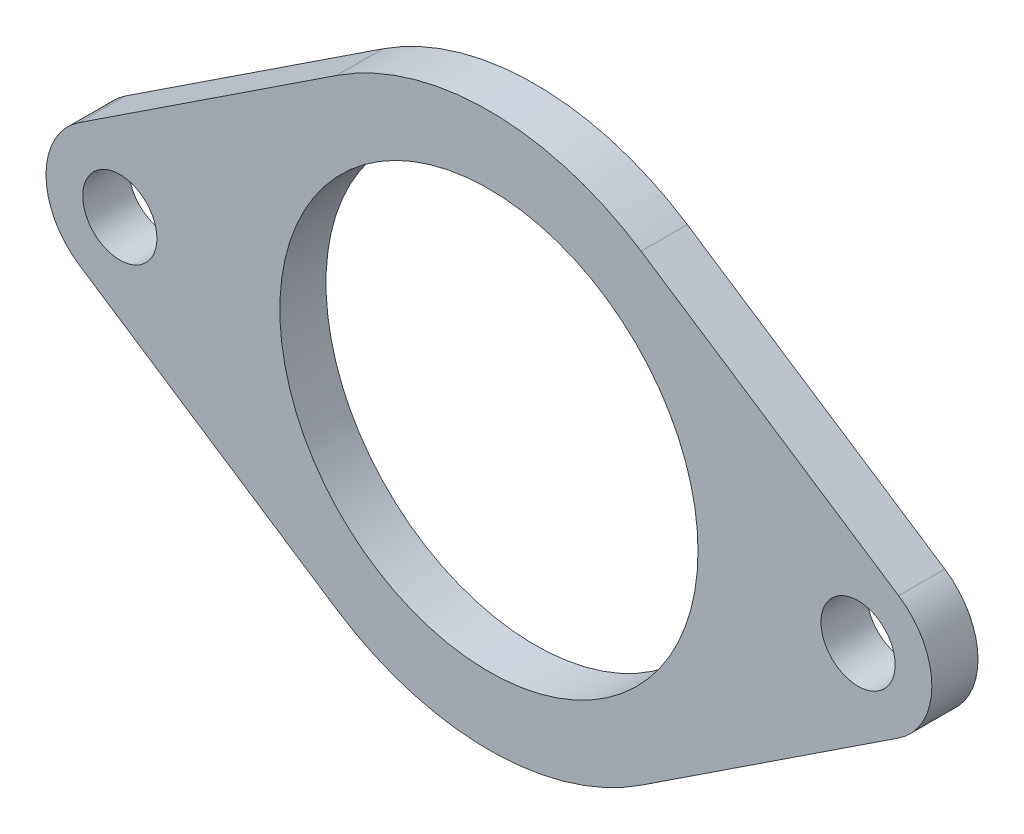
ISO-10303-21;
HEADER;
FILE_DESCRIPTION(('STEP AP214'),'2;1');
FILE_NAME('part.step','',(''),(''),'','','');
FILE_SCHEMA(('AUTOMOTIVE_DESIGN { 1 0 10303 214 1 1 1 1 }'));
ENDSEC;
DATA;
#1=APPLICATION_CONTEXT('core data for automotive mechanical design processes');
#2=APPLICATION_PROTOCOL_DEFINITION('international standard','automotive_design',2000,#1);
#3=PRODUCT_CONTEXT('',#1,'mechanical');
#4=PRODUCT('Part','Part','',(#3));
#5=PRODUCT_RELATED_PRODUCT_CATEGORY('part','',(#4));
#6=PRODUCT_DEFINITION_FORMATION('','',#4);
#7=PRODUCT_DEFINITION_CONTEXT('part definition',#1,'design');
#8=PRODUCT_DEFINITION('design','',#6,#7);
#9=PRODUCT_DEFINITION_SHAPE('','',#8);
#10=(LENGTH_UNIT() NAMED_UNIT(*) SI_UNIT(.MILLI.,.METRE.));
#11=(NAMED_UNIT(*) PLANE_ANGLE_UNIT() SI_UNIT($,.RADIAN.));
#12=(NAMED_UNIT(*) SI_UNIT($,.STERADIAN.) SOLID_ANGLE_UNIT());
#13=UNCERTAINTY_MEASURE_WITH_UNIT(LENGTH_MEASURE(1.E-05),#10,'distance_accuracy_value','');
#14=(GEOMETRIC_REPRESENTATION_CONTEXT(3) GLOBAL_UNCERTAINTY_ASSIGNED_CONTEXT((#13)) GLOBAL_UNIT_ASSIGNED_CONTEXT((#10,
#11,#12)) REPRESENTATION_CONTEXT('',''));
#15=CARTESIAN_POINT('',(0.,0.,0.));
#16=DIRECTION('',(0.,0.,1.));
#17=DIRECTION('',(1.,0.,0.));
#18=AXIS2_PLACEMENT_3D('',#15,#16,#17);
#19=CARTESIAN_POINT('',(0.,0.,3.175));
#20=DIRECTION('',(0.,0.,-1.));
#21=DIRECTION('',(-1.,0.,0.));
#22=AXIS2_PLACEMENT_3D('',#19,#20,#21);
#23=PLANE('',#22);
#24=CARTESIAN_POINT('',(0.,0.,3.175));
#25=DIRECTION('',(0.,0.,1.));
#26=DIRECTION('',(-1.,0.,0.));
#27=AXIS2_PLACEMENT_3D('',#24,#25,#26);
#28=CIRCLE('',#27,19.0500000000001);
#29=CARTESIAN_POINT('',(10.4775,15.9098866667868,3.175));
#30=VERTEX_POINT('',#29);
#31=CARTESIAN_POINT('',(-10.4775,15.9098866667868,3.175));
#32=VERTEX_POINT('',#31);
#33=EDGE_CURVE('E164',#30,#32,#28,.T.);
#34=ORIENTED_EDGE('',*,*,#33,.T.);
#35=DIRECTION('',(-0.835164654424503,-0.55,0.));
#36=VECTOR('',#35,1.);
#37=CARTESIAN_POINT('',(-10.4775,15.9098866667868,3.175));
#38=LINE('',#37,#36);
#39=CARTESIAN_POINT('',(-28.194,4.24263644447648,3.175));
#40=VERTEX_POINT('',#39);
#41=EDGE_CURVE('E100',#32,#40,#38,.T.);
#42=ORIENTED_EDGE('',*,*,#41,.T.);
#43=CARTESIAN_POINT('',(-25.4,0.,3.175));
#44=DIRECTION('',(0.,0.,1.));
#45=DIRECTION('',(1.,0.,0.));
#46=AXIS2_PLACEMENT_3D('',#43,#44,#45);
#47=CIRCLE('',#46,5.08000000000001);
#48=CARTESIAN_POINT('',(-28.194,-4.24263644447648,3.175));
#49=VERTEX_POINT('',#48);
#50=EDGE_CURVE('E185',#40,#49,#47,.T.);
#51=ORIENTED_EDGE('',*,*,#50,.T.);
#52=DIRECTION('',(0.835164654424503,-0.55,0.));
#53=VECTOR('',#52,1.);
#54=CARTESIAN_POINT('',(-10.4775,-15.9098866667868,3.175));
#55=LINE('',#54,#53);
#56=CARTESIAN_POINT('',(-10.4775,-15.9098866667868,3.175));
#57=VERTEX_POINT('',#56);
#58=EDGE_CURVE('E199',#49,#57,#55,.T.);
#59=ORIENTED_EDGE('',*,*,#58,.T.);
#60=CARTESIAN_POINT('',(0.,3.20923843055709E-13,3.175));
#61=DIRECTION('',(0.,0.,1.));
#62=DIRECTION('',(-1.,0.,0.));
#63=AXIS2_PLACEMENT_3D('',#60,#61,#62);
#64=CIRCLE('',#63,19.0500000000003);
#65=CARTESIAN_POINT('',(10.4775,-15.9098866667868,3.175));
#66=VERTEX_POINT('',#65);
#67=EDGE_CURVE('E119',#57,#66,#64,.T.);
#68=ORIENTED_EDGE('',*,*,#67,.T.);
#69=DIRECTION('',(0.835164654424503,0.55,0.));
#70=VECTOR('',#69,1.);
#71=CARTESIAN_POINT('',(28.194,-4.24263644447647,3.175));
#72=LINE('',#71,#70);
#73=CARTESIAN_POINT('',(28.194,-4.24263644447647,3.175));
#74=VERTEX_POINT('',#73);
#75=EDGE_CURVE('E113',#66,#74,#72,.T.);
#76=ORIENTED_EDGE('',*,*,#75,.T.);
#77=CARTESIAN_POINT('',(25.4,0.,3.175));
#78=DIRECTION('',(0.,0.,1.));
#79=DIRECTION('',(-1.,0.,0.));
#80=AXIS2_PLACEMENT_3D('',#77,#78,#79);
#81=CIRCLE('',#80,5.08);
#82=CARTESIAN_POINT('',(28.194,4.24263644447647,3.175));
#83=VERTEX_POINT('',#82);
#84=EDGE_CURVE('E117',#74,#83,#81,.T.);
#85=ORIENTED_EDGE('',*,*,#84,.T.);
#86=DIRECTION('',(-0.835164654424503,0.55,0.));
#87=VECTOR('',#86,1.);
#88=CARTESIAN_POINT('',(10.4775,15.9098866667868,3.175));
#89=LINE('',#88,#87);
#90=EDGE_CURVE('E57',#83,#30,#89,.T.);
#91=ORIENTED_EDGE('',*,*,#90,.T.);
#92=EDGE_LOOP('',(#34,#42,#51,#59,#68,#76,#85,#91));
#93=FACE_BOUND('',#92,.T.);
#94=CARTESIAN_POINT('',(0.,0.,3.175));
#95=DIRECTION('',(0.,0.,1.));
#96=DIRECTION('',(1.,0.,0.));
#97=AXIS2_PLACEMENT_3D('',#94,#95,#96);
#98=CIRCLE('',#97,14.3891);
#99=CARTESIAN_POINT('',(14.3891,0.,3.175));
#100=VERTEX_POINT('',#99);
#101=EDGE_CURVE('E146',#100,#100,#98,.T.);
#102=ORIENTED_EDGE('',*,*,#101,.F.);
#103=EDGE_LOOP('',(#102));
#104=FACE_BOUND('',#103,.T.);
#105=CARTESIAN_POINT('',(-25.4,0.,3.175));
#106=DIRECTION('',(0.,0.,1.));
#107=DIRECTION('',(1.,0.,0.));
#108=AXIS2_PLACEMENT_3D('',#105,#106,#107);
#109=CIRCLE('',#108,2.5527);
#110=CARTESIAN_POINT('',(-22.8473,0.,3.175));
#111=VERTEX_POINT('',#110);
#112=EDGE_CURVE('E213',#111,#111,#109,.T.);
#113=ORIENTED_EDGE('',*,*,#112,.F.);
#114=EDGE_LOOP('',(#113));
#115=FACE_BOUND('',#114,.T.);
#116=CARTESIAN_POINT('',(25.4,0.,3.175));
#117=DIRECTION('',(0.,0.,1.));
#118=DIRECTION('',(1.,0.,0.));
#119=AXIS2_PLACEMENT_3D('',#116,#117,#118);
#120=CIRCLE('',#119,2.5527);
#121=CARTESIAN_POINT('',(27.9527,0.,3.175));
#122=VERTEX_POINT('',#121);
#123=EDGE_CURVE('E221',#122,#122,#120,.T.);
#124=ORIENTED_EDGE('',*,*,#123,.F.);
#125=EDGE_LOOP('',(#124));
#126=FACE_BOUND('',#125,.T.);
#127=ADVANCED_FACE('F39',(#93,#104,#115,#126),#23,.F.);
#128=CARTESIAN_POINT('',(0.,0.,0.));
#129=DIRECTION('',(0.,0.,-1.));
#130=DIRECTION('',(-1.,0.,0.));
#131=AXIS2_PLACEMENT_3D('',#128,#129,#130);
#132=PLANE('',#131);
#133=CARTESIAN_POINT('',(-25.4,0.,0.));
#134=DIRECTION('',(0.,0.,1.));
#135=DIRECTION('',(1.,0.,0.));
#136=AXIS2_PLACEMENT_3D('',#133,#134,#135);
#137=CIRCLE('',#136,2.5527);
#138=CARTESIAN_POINT('',(-22.8473,0.,0.));
#139=VERTEX_POINT('',#138);
#140=EDGE_CURVE('E217',#139,#139,#137,.T.);
#141=ORIENTED_EDGE('',*,*,#140,.T.);
#142=EDGE_LOOP('',(#141));
#143=FACE_BOUND('',#142,.T.);
#144=CARTESIAN_POINT('',(0.,0.,0.));
#145=DIRECTION('',(0.,0.,1.));
#146=DIRECTION('',(-1.,0.,0.));
#147=AXIS2_PLACEMENT_3D('',#144,#145,#146);
#148=CIRCLE('',#147,19.0500000000001);
#149=CARTESIAN_POINT('',(10.4775,15.9098866667868,0.));
#150=VERTEX_POINT('',#149);
#151=CARTESIAN_POINT('',(-10.4775,15.9098866667868,0.));
#152=VERTEX_POINT('',#151);
#153=EDGE_CURVE('E141',#150,#152,#148,.T.);
#154=ORIENTED_EDGE('',*,*,#153,.F.);
#155=DIRECTION('',(-0.835164654424503,0.55,0.));
#156=VECTOR('',#155,1.);
#157=CARTESIAN_POINT('',(10.4775,15.9098866667868,0.));
#158=LINE('',#157,#156);
#159=CARTESIAN_POINT('',(28.194,4.24263644447647,0.));
#160=VERTEX_POINT('',#159);
#161=EDGE_CURVE('E92',#160,#150,#158,.T.);
#162=ORIENTED_EDGE('',*,*,#161,.F.);
#163=CARTESIAN_POINT('',(25.4,0.,0.));
#164=DIRECTION('',(0.,0.,1.));
#165=DIRECTION('',(-1.,0.,0.));
#166=AXIS2_PLACEMENT_3D('',#163,#164,#165);
#167=CIRCLE('',#166,5.08);
#168=CARTESIAN_POINT('',(28.194,-4.24263644447647,0.));
#169=VERTEX_POINT('',#168);
#170=EDGE_CURVE('E86',#169,#160,#167,.T.);
#171=ORIENTED_EDGE('',*,*,#170,.F.);
#172=DIRECTION('',(0.835164654424503,0.55,0.));
#173=VECTOR('',#172,1.);
#174=CARTESIAN_POINT('',(28.194,-4.24263644447647,0.));
#175=LINE('',#174,#173);
#176=CARTESIAN_POINT('',(10.4775,-15.9098866667868,0.));
#177=VERTEX_POINT('',#176);
#178=EDGE_CURVE('E128',#177,#169,#175,.T.);
#179=ORIENTED_EDGE('',*,*,#178,.F.);
#180=CARTESIAN_POINT('',(0.,3.20923843055709E-13,0.));
#181=DIRECTION('',(0.,0.,1.));
#182=DIRECTION('',(-1.,0.,0.));
#183=AXIS2_PLACEMENT_3D('',#180,#181,#182);
#184=CIRCLE('',#183,19.0500000000003);
#185=CARTESIAN_POINT('',(-10.4775,-15.9098866667868,0.));
#186=VERTEX_POINT('',#185);
#187=EDGE_CURVE('E155',#186,#177,#184,.T.);
#188=ORIENTED_EDGE('',*,*,#187,.F.);
#189=DIRECTION('',(0.835164654424503,-0.55,0.));
#190=VECTOR('',#189,1.);
#191=CARTESIAN_POINT('',(-10.4775,-15.9098866667868,0.));
#192=LINE('',#191,#190);
#193=CARTESIAN_POINT('',(-28.194,-4.24263644447648,0.));
#194=VERTEX_POINT('',#193);
#195=EDGE_CURVE('E152',#194,#186,#192,.T.);
#196=ORIENTED_EDGE('',*,*,#195,.F.);
#197=CARTESIAN_POINT('',(-25.4,0.,0.));
#198=DIRECTION('',(0.,0.,1.));
#199=DIRECTION('',(1.,0.,0.));
#200=AXIS2_PLACEMENT_3D('',#197,#198,#199);
#201=CIRCLE('',#200,5.08000000000001);
#202=CARTESIAN_POINT('',(-28.194,4.24263644447648,0.));
#203=VERTEX_POINT('',#202);
#204=EDGE_CURVE('E149',#203,#194,#201,.T.);
#205=ORIENTED_EDGE('',*,*,#204,.F.);
#206=DIRECTION('',(-0.835164654424503,-0.55,0.));
#207=VECTOR('',#206,1.);
#208=CARTESIAN_POINT('',(-10.4775,15.9098866667868,0.));
#209=LINE('',#208,#207);
#210=EDGE_CURVE('E145',#152,#203,#209,.T.);
#211=ORIENTED_EDGE('',*,*,#210,.F.);
#212=EDGE_LOOP('',(#154,#162,#171,#179,#188,#196,#205,#211));
#213=FACE_BOUND('',#212,.T.);
#214=CARTESIAN_POINT('',(0.,0.,0.));
#215=DIRECTION('',(0.,0.,1.));
#216=DIRECTION('',(1.,0.,0.));
#217=AXIS2_PLACEMENT_3D('',#214,#215,#216);
#218=CIRCLE('',#217,14.3891);
#219=CARTESIAN_POINT('',(14.3891,0.,0.));
#220=VERTEX_POINT('',#219);
#221=EDGE_CURVE('E209',#220,#220,#218,.T.);
#222=ORIENTED_EDGE('',*,*,#221,.T.);
#223=EDGE_LOOP('',(#222));
#224=FACE_BOUND('',#223,.T.);
#225=CARTESIAN_POINT('',(25.4,0.,0.));
#226=DIRECTION('',(0.,0.,1.));
#227=DIRECTION('',(1.,0.,0.));
#228=AXIS2_PLACEMENT_3D('',#225,#226,#227);
#229=CIRCLE('',#228,2.5527);
#230=CARTESIAN_POINT('',(27.9527,0.,0.));
#231=VERTEX_POINT('',#230);
#232=EDGE_CURVE('E225',#231,#231,#229,.T.);
#233=ORIENTED_EDGE('',*,*,#232,.T.);
#234=EDGE_LOOP('',(#233));
#235=FACE_BOUND('',#234,.T.);
#236=ADVANCED_FACE('F189',(#143,#213,#224,#235),#132,.T.);
#237=CARTESIAN_POINT('',(0.,0.,3.175));
#238=DIRECTION('',(0.,0.,-1.));
#239=DIRECTION('',(-1.,0.,0.));
#240=AXIS2_PLACEMENT_3D('',#237,#238,#239);
#241=CYLINDRICAL_SURFACE('',#240,19.0500000000001);
#242=ORIENTED_EDGE('',*,*,#153,.T.);
#243=DIRECTION('',(0.,0.,-1.));
#244=VECTOR('',#243,1.);
#245=CARTESIAN_POINT('',(-10.4775,15.9098866667868,3.175));
#246=LINE('',#245,#244);
#247=EDGE_CURVE('E11',#32,#152,#246,.T.);
#248=ORIENTED_EDGE('',*,*,#247,.F.);
#249=ORIENTED_EDGE('',*,*,#33,.F.);
#250=DIRECTION('',(0.,0.,-1.));
#251=VECTOR('',#250,1.);
#252=CARTESIAN_POINT('',(10.4775,15.9098866667868,3.175));
#253=LINE('',#252,#251);
#254=EDGE_CURVE('E137',#30,#150,#253,.T.);
#255=ORIENTED_EDGE('',*,*,#254,.T.);
#256=EDGE_LOOP('',(#242,#248,#249,#255));
#257=FACE_BOUND('',#256,.T.);
#258=ADVANCED_FACE('F41',(#257),#241,.T.);
#259=CARTESIAN_POINT('',(-10.4775,15.9098866667868,3.175));
#260=DIRECTION('',(0.55,-0.835164654424503,0.));
#261=DIRECTION('',(0.835164654424503,0.55,0.));
#262=AXIS2_PLACEMENT_3D('',#259,#260,#261);
#263=PLANE('',#262);
#264=ORIENTED_EDGE('',*,*,#210,.T.);
#265=DIRECTION('',(0.,0.,-1.));
#266=VECTOR('',#265,1.);
#267=CARTESIAN_POINT('',(-28.194,4.24263644447648,3.175));
#268=LINE('',#267,#266);
#269=EDGE_CURVE('E49',#40,#203,#268,.T.);
#270=ORIENTED_EDGE('',*,*,#269,.F.);
#271=ORIENTED_EDGE('',*,*,#41,.F.);
#272=ORIENTED_EDGE('',*,*,#247,.T.);
#273=EDGE_LOOP('',(#264,#270,#271,#272));
#274=FACE_BOUND('',#273,.T.);
#275=ADVANCED_FACE('F259',(#274),#263,.F.);
#276=CARTESIAN_POINT('',(-25.4,0.,3.175));
#277=DIRECTION('',(0.,0.,-1.));
#278=DIRECTION('',(-1.,0.,0.));
#279=AXIS2_PLACEMENT_3D('',#276,#277,#278);
#280=CYLINDRICAL_SURFACE('',#279,5.08000000000001);
#281=ORIENTED_EDGE('',*,*,#204,.T.);
#282=DIRECTION('',(0.,0.,-1.));
#283=VECTOR('',#282,1.);
#284=CARTESIAN_POINT('',(-28.194,-4.24263644447648,3.175));
#285=LINE('',#284,#283);
#286=EDGE_CURVE('E175',#49,#194,#285,.T.);
#287=ORIENTED_EDGE('',*,*,#286,.F.);
#288=ORIENTED_EDGE('',*,*,#50,.F.);
#289=ORIENTED_EDGE('',*,*,#269,.T.);
#290=EDGE_LOOP('',(#281,#287,#288,#289));
#291=FACE_BOUND('',#290,.T.);
#292=ADVANCED_FACE('F183',(#291),#280,.T.);
#293=CARTESIAN_POINT('',(-10.4775,-15.9098866667868,3.175));
#294=DIRECTION('',(0.55,0.835164654424503,0.));
#295=DIRECTION('',(-0.835164654424503,0.55,0.));
#296=AXIS2_PLACEMENT_3D('',#293,#294,#295);
#297=PLANE('',#296);
#298=ORIENTED_EDGE('',*,*,#195,.T.);
#299=DIRECTION('',(0.,0.,-1.));
#300=VECTOR('',#299,1.);
#301=CARTESIAN_POINT('',(-10.4775,-15.9098866667868,3.175));
#302=LINE('',#301,#300);
#303=EDGE_CURVE('E171',#57,#186,#302,.T.);
#304=ORIENTED_EDGE('',*,*,#303,.F.);
#305=ORIENTED_EDGE('',*,*,#58,.F.);
#306=ORIENTED_EDGE('',*,*,#286,.T.);
#307=EDGE_LOOP('',(#298,#304,#305,#306));
#308=FACE_BOUND('',#307,.T.);
#309=ADVANCED_FACE('F194',(#308),#297,.F.);
#310=CARTESIAN_POINT('',(0.,3.20923843055709E-13,3.175));
#311=DIRECTION('',(0.,0.,-1.));
#312=DIRECTION('',(-1.,0.,0.));
#313=AXIS2_PLACEMENT_3D('',#310,#311,#312);
#314=CYLINDRICAL_SURFACE('',#313,19.0500000000003);
#315=ORIENTED_EDGE('',*,*,#187,.T.);
#316=DIRECTION('',(0.,0.,-1.));
#317=VECTOR('',#316,1.);
#318=CARTESIAN_POINT('',(10.4775,-15.9098866667868,3.175));
#319=LINE('',#318,#317);
#320=EDGE_CURVE('E130',#66,#177,#319,.T.);
#321=ORIENTED_EDGE('',*,*,#320,.F.);
#322=ORIENTED_EDGE('',*,*,#67,.F.);
#323=ORIENTED_EDGE('',*,*,#303,.T.);
#324=EDGE_LOOP('',(#315,#321,#322,#323));
#325=FACE_BOUND('',#324,.T.);
#326=ADVANCED_FACE('F197',(#325),#314,.T.);
#327=CARTESIAN_POINT('',(28.194,-4.24263644447647,3.175));
#328=DIRECTION('',(-0.55,0.835164654424503,0.));
#329=DIRECTION('',(-0.835164654424503,-0.55,0.));
#330=AXIS2_PLACEMENT_3D('',#327,#328,#329);
#331=PLANE('',#330);
#332=ORIENTED_EDGE('',*,*,#178,.T.);
#333=DIRECTION('',(0.,0.,-1.));
#334=VECTOR('',#333,1.);
#335=CARTESIAN_POINT('',(28.194,-4.24263644447647,3.175));
#336=LINE('',#335,#334);
#337=EDGE_CURVE('E125',#74,#169,#336,.T.);
#338=ORIENTED_EDGE('',*,*,#337,.F.);
#339=ORIENTED_EDGE('',*,*,#75,.F.);
#340=ORIENTED_EDGE('',*,*,#320,.T.);
#341=EDGE_LOOP('',(#332,#338,#339,#340));
#342=FACE_BOUND('',#341,.T.);
#343=ADVANCED_FACE('F126',(#342),#331,.F.);
#344=CARTESIAN_POINT('',(25.4,0.,3.175));
#345=DIRECTION('',(0.,0.,-1.));
#346=DIRECTION('',(-1.,0.,0.));
#347=AXIS2_PLACEMENT_3D('',#344,#345,#346);
#348=CYLINDRICAL_SURFACE('',#347,5.08);
#349=ORIENTED_EDGE('',*,*,#170,.T.);
#350=DIRECTION('',(0.,0.,-1.));
#351=VECTOR('',#350,1.);
#352=CARTESIAN_POINT('',(28.194,4.24263644447647,3.175));
#353=LINE('',#352,#351);
#354=EDGE_CURVE('E131',#83,#160,#353,.T.);
#355=ORIENTED_EDGE('',*,*,#354,.F.);
#356=ORIENTED_EDGE('',*,*,#84,.F.);
#357=ORIENTED_EDGE('',*,*,#337,.T.);
#358=EDGE_LOOP('',(#349,#355,#356,#357));
#359=FACE_BOUND('',#358,.T.);
#360=ADVANCED_FACE('F133',(#359),#348,.T.);
#361=CARTESIAN_POINT('',(10.4775,15.9098866667868,3.175));
#362=DIRECTION('',(-0.55,-0.835164654424503,0.));
#363=DIRECTION('',(0.835164654424503,-0.55,0.));
#364=AXIS2_PLACEMENT_3D('',#361,#362,#363);
#365=PLANE('',#364);
#366=ORIENTED_EDGE('',*,*,#161,.T.);
#367=ORIENTED_EDGE('',*,*,#254,.F.);
#368=ORIENTED_EDGE('',*,*,#90,.F.);
#369=ORIENTED_EDGE('',*,*,#354,.T.);
#370=EDGE_LOOP('',(#366,#367,#368,#369));
#371=FACE_BOUND('',#370,.T.);
#372=ADVANCED_FACE('F247',(#371),#365,.F.);
#373=CARTESIAN_POINT('',(0.,0.,3.175));
#374=DIRECTION('',(0.,0.,-1.));
#375=DIRECTION('',(-1.,0.,0.));
#376=AXIS2_PLACEMENT_3D('',#373,#374,#375);
#377=CYLINDRICAL_SURFACE('',#376,14.3891);
#378=ORIENTED_EDGE('',*,*,#101,.T.);
#379=EDGE_LOOP('',(#378));
#380=FACE_BOUND('',#379,.T.);
#381=ORIENTED_EDGE('',*,*,#221,.F.);
#382=EDGE_LOOP('',(#381));
#383=FACE_BOUND('',#382,.T.);
#384=ADVANCED_FACE('F244',(#380,#383),#377,.F.);
#385=CARTESIAN_POINT('',(-25.4,0.,3.175));
#386=DIRECTION('',(0.,0.,-1.));
#387=DIRECTION('',(-1.,0.,0.));
#388=AXIS2_PLACEMENT_3D('',#385,#386,#387);
#389=CYLINDRICAL_SURFACE('',#388,2.5527);
#390=ORIENTED_EDGE('',*,*,#112,.T.);
#391=EDGE_LOOP('',(#390));
#392=FACE_BOUND('',#391,.T.);
#393=ORIENTED_EDGE('',*,*,#140,.F.);
#394=EDGE_LOOP('',(#393));
#395=FACE_BOUND('',#394,.T.);
#396=ADVANCED_FACE('F323',(#392,#395),#389,.F.);
#397=CARTESIAN_POINT('',(25.4,0.,3.175));
#398=DIRECTION('',(0.,0.,-1.));
#399=DIRECTION('',(-1.,0.,0.));
#400=AXIS2_PLACEMENT_3D('',#397,#398,#399);
#401=CYLINDRICAL_SURFACE('',#400,2.5527);
#402=ORIENTED_EDGE('',*,*,#123,.T.);
#403=EDGE_LOOP('',(#402));
#404=FACE_BOUND('',#403,.T.);
#405=ORIENTED_EDGE('',*,*,#232,.F.);
#406=EDGE_LOOP('',(#405));
#407=FACE_BOUND('',#406,.T.);
#408=ADVANCED_FACE('F233',(#404,#407),#401,.F.);
#409=CLOSED_SHELL('',(#127,#236,#258,#275,#292,#309,#326,#343,#360,#372,#384,#396,#408));
#410=MANIFOLD_SOLID_BREP('B2',#409);
#411=ADVANCED_BREP_SHAPE_REPRESENTATION('',(#18,#410),#14);
#412=SHAPE_DEFINITION_REPRESENTATION(#9,#411);
ENDSEC;
END-ISO-10303-21;
